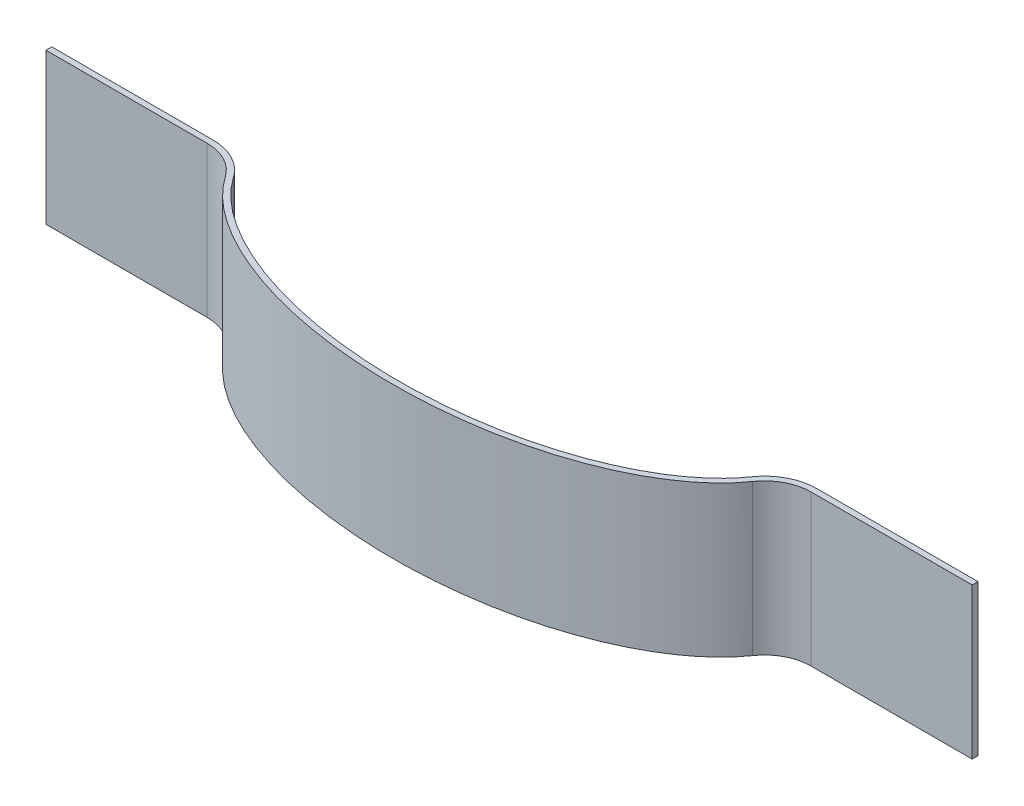
ISO-10303-21;
HEADER;
FILE_DESCRIPTION(('STEP AP214'),'2;1');
FILE_NAME('part.step','',(''),(''),'','','');
FILE_SCHEMA(('AUTOMOTIVE_DESIGN { 1 0 10303 214 1 1 1 1 }'));
ENDSEC;
DATA;
#1=APPLICATION_CONTEXT('core data for automotive mechanical design processes');
#2=APPLICATION_PROTOCOL_DEFINITION('international standard','automotive_design',2000,#1);
#3=PRODUCT_CONTEXT('',#1,'mechanical');
#4=PRODUCT('Part','Part','',(#3));
#5=PRODUCT_RELATED_PRODUCT_CATEGORY('part','',(#4));
#6=PRODUCT_DEFINITION_FORMATION('','',#4);
#7=PRODUCT_DEFINITION_CONTEXT('part definition',#1,'design');
#8=PRODUCT_DEFINITION('design','',#6,#7);
#9=PRODUCT_DEFINITION_SHAPE('','',#8);
#10=(LENGTH_UNIT() NAMED_UNIT(*) SI_UNIT(.MILLI.,.METRE.));
#11=(NAMED_UNIT(*) PLANE_ANGLE_UNIT() SI_UNIT($,.RADIAN.));
#12=(NAMED_UNIT(*) SI_UNIT($,.STERADIAN.) SOLID_ANGLE_UNIT());
#13=UNCERTAINTY_MEASURE_WITH_UNIT(LENGTH_MEASURE(1.E-05),#10,'distance_accuracy_value','');
#14=(GEOMETRIC_REPRESENTATION_CONTEXT(3) GLOBAL_UNCERTAINTY_ASSIGNED_CONTEXT((#13)) GLOBAL_UNIT_ASSIGNED_CONTEXT((#10,
#11,#12)) REPRESENTATION_CONTEXT('',''));
#15=CARTESIAN_POINT('',(0.,0.,0.));
#16=DIRECTION('',(0.,0.,1.));
#17=DIRECTION('',(1.,0.,0.));
#18=AXIS2_PLACEMENT_3D('',#15,#16,#17);
#19=CARTESIAN_POINT('',(82.8323720749977,15.9999999949704,4.99999999502958));
#20=DIRECTION('',(-1.,0.,0.));
#21=DIRECTION('',(0.,0.,1.));
#22=AXIS2_PLACEMENT_3D('',#19,#20,#21);
#23=PLANE('',#22);
#24=DIRECTION('',(0.,-1.,0.));
#25=VECTOR('',#24,1.);
#26=CARTESIAN_POINT('',(82.8323720749977,15.9999999949704,6.99999999502965));
#27=LINE('',#26,#25);
#28=CARTESIAN_POINT('',(82.8323720749977,15.9999999949704,6.99999999502965));
#29=VERTEX_POINT('',#28);
#30=CARTESIAN_POINT('',(82.8323720749977,3.,6.99999999502965));
#31=VERTEX_POINT('',#30);
#32=EDGE_CURVE('E405',#29,#31,#27,.T.);
#33=ORIENTED_EDGE('',*,*,#32,.T.);
#34=DIRECTION('',(0.,0.,-1.));
#35=VECTOR('',#34,1.);
#36=CARTESIAN_POINT('',(82.8323720749977,3.,4.99999999502958));
#37=LINE('',#36,#35);
#38=CARTESIAN_POINT('',(82.8323720749977,3.,6.49999999502962));
#39=VERTEX_POINT('',#38);
#40=EDGE_CURVE('E12',#31,#39,#37,.T.);
#41=ORIENTED_EDGE('',*,*,#40,.T.);
#42=DIRECTION('',(0.,-1.,0.));
#43=VECTOR('',#42,1.);
#44=CARTESIAN_POINT('',(82.8323720749977,15.9999999949704,6.49999999502962));
#45=LINE('',#44,#43);
#46=CARTESIAN_POINT('',(82.8323720749977,15.9999999949704,6.49999999502962));
#47=VERTEX_POINT('',#46);
#48=EDGE_CURVE('E322',#47,#39,#45,.T.);
#49=ORIENTED_EDGE('',*,*,#48,.F.);
#50=DIRECTION('',(0.,0.,-1.));
#51=VECTOR('',#50,1.);
#52=CARTESIAN_POINT('',(82.8323720749977,15.9999999949704,4.99999999502958));
#53=LINE('',#52,#51);
#54=EDGE_CURVE('E139',#29,#47,#53,.T.);
#55=ORIENTED_EDGE('',*,*,#54,.F.);
#56=EDGE_LOOP('',(#33,#41,#49,#55));
#57=FACE_BOUND('',#56,.T.);
#58=ADVANCED_FACE('F128',(#57),#23,.F.);
#59=CARTESIAN_POINT('',(3.,2.99999999999999,4.99999999502958));
#60=DIRECTION('',(1.,0.,0.));
#61=DIRECTION('',(0.,1.,0.));
#62=AXIS2_PLACEMENT_3D('',#59,#60,#61);
#63=PLANE('',#62);
#64=DIRECTION('',(0.,-1.,0.));
#65=VECTOR('',#64,1.);
#66=CARTESIAN_POINT('',(3.,15.9999999949704,6.99999999502963));
#67=LINE('',#66,#65);
#68=CARTESIAN_POINT('',(3.,15.9999999949704,6.99999999502963));
#69=VERTEX_POINT('',#68);
#70=CARTESIAN_POINT('',(3.,2.99999999999999,6.99999999502963));
#71=VERTEX_POINT('',#70);
#72=EDGE_CURVE('E400',#69,#71,#67,.T.);
#73=ORIENTED_EDGE('',*,*,#72,.F.);
#74=DIRECTION('',(0.,0.,-1.));
#75=VECTOR('',#74,1.);
#76=CARTESIAN_POINT('',(3.,15.9999999949704,4.99999999502958));
#77=LINE('',#76,#75);
#78=CARTESIAN_POINT('',(3.,15.9999999949704,6.49999999502962));
#79=VERTEX_POINT('',#78);
#80=EDGE_CURVE('E306',#69,#79,#77,.T.);
#81=ORIENTED_EDGE('',*,*,#80,.T.);
#82=DIRECTION('',(0.,-1.,0.));
#83=VECTOR('',#82,1.);
#84=CARTESIAN_POINT('',(3.,15.9999999949704,6.49999999502962));
#85=LINE('',#84,#83);
#86=CARTESIAN_POINT('',(3.,2.99999999999999,6.49999999502962));
#87=VERTEX_POINT('',#86);
#88=EDGE_CURVE('E327',#79,#87,#85,.T.);
#89=ORIENTED_EDGE('',*,*,#88,.T.);
#90=DIRECTION('',(0.,0.,-1.));
#91=VECTOR('',#90,1.);
#92=CARTESIAN_POINT('',(3.,2.99999999999999,4.99999999502958));
#93=LINE('',#92,#91);
#94=EDGE_CURVE('E304',#71,#87,#93,.T.);
#95=ORIENTED_EDGE('',*,*,#94,.F.);
#96=EDGE_LOOP('',(#73,#81,#89,#95));
#97=FACE_BOUND('',#96,.T.);
#98=ADVANCED_FACE('F263',(#97),#63,.F.);
#99=CARTESIAN_POINT('',(82.8323720749977,3.,4.99999999502958));
#100=DIRECTION('',(0.,1.,0.));
#101=DIRECTION('',(-1.,0.,0.));
#102=AXIS2_PLACEMENT_3D('',#99,#100,#101);
#103=PLANE('',#102);
#104=DIRECTION('',(-1.,0.,0.));
#105=VECTOR('',#104,1.);
#106=CARTESIAN_POINT('',(0.,2.99999999999999,6.99999999502965));
#107=LINE('',#106,#105);
#108=CARTESIAN_POINT('',(16.8897912138371,2.99999999999999,6.99999999502961));
#109=VERTEX_POINT('',#108);
#110=EDGE_CURVE('E412',#109,#71,#107,.T.);
#111=ORIENTED_EDGE('',*,*,#110,.T.);
#112=ORIENTED_EDGE('',*,*,#94,.T.);
#113=DIRECTION('',(-1.,0.,0.));
#114=VECTOR('',#113,1.);
#115=CARTESIAN_POINT('',(0.,2.99999999999999,6.49999999502965));
#116=LINE('',#115,#114);
#117=CARTESIAN_POINT('',(16.8897912138371,2.99999999999999,6.49999999502961));
#118=VERTEX_POINT('',#117);
#119=EDGE_CURVE('E289',#118,#87,#116,.T.);
#120=ORIENTED_EDGE('',*,*,#119,.F.);
#121=CARTESIAN_POINT('',(16.8897912138371,2.99999999999999,10.9999999950296));
#122=DIRECTION('',(0.,-1.,0.));
#123=DIRECTION('',(1.,0.,0.));
#124=AXIS2_PLACEMENT_3D('',#121,#122,#123);
#125=CIRCLE('',#124,4.5);
#126=CARTESIAN_POINT('',(20.5970419141015,2.99999999999999,8.44925652588402));
#127=VERTEX_POINT('',#126);
#128=EDGE_CURVE('E287',#118,#127,#125,.T.);
#129=ORIENTED_EDGE('',*,*,#128,.T.);
#130=CARTESIAN_POINT('',(65.2353301658985,3.,8.44925652588398));
#131=CARTESIAN_POINT('',(64.8805017070055,3.,8.96496422782135));
#132=CARTESIAN_POINT('',(64.4364787447375,3.,9.48700047676515));
#133=CARTESIAN_POINT('',(63.3731418806885,3.,10.518242468489));
#134=CARTESIAN_POINT('',(62.7507898739107,3.,11.0291632976975));
#135=CARTESIAN_POINT('',(61.3393789945147,3.,12.0106415730153));
#136=CARTESIAN_POINT('',(60.5491740004586,3.,12.4830373082159));
#137=CARTESIAN_POINT('',(58.8199079028753,3.,13.3651280551237));
#138=CARTESIAN_POINT('',(57.88322636954,3.,13.7749356231123));
#139=CARTESIAN_POINT('',(55.888989887528,3.,14.5215991829222));
#140=CARTESIAN_POINT('',(54.8314557800261,3.,14.8583610099948));
#141=CARTESIAN_POINT('',(52.6202204017722,3.,15.444721578542));
#142=CARTESIAN_POINT('',(51.4658389144935,3.,15.693398240126));
#143=CARTESIAN_POINT('',(47.9107668985225,3.,16.292489366061));
#144=CARTESIAN_POINT('',(45.4153646913092,3.,16.4999999950296));
#145=CARTESIAN_POINT('',(40.4170073886908,3.,16.4999999950296));
#146=CARTESIAN_POINT('',(37.9216051814775,3.,16.292489366061));
#147=CARTESIAN_POINT('',(34.3665331655065,3.,15.693398240126));
#148=CARTESIAN_POINT('',(33.2121516782278,3.,15.444721578542));
#149=CARTESIAN_POINT('',(31.0009162999739,3.,14.8583610099948));
#150=CARTESIAN_POINT('',(29.9433821924721,3.,14.5215991829222));
#151=CARTESIAN_POINT('',(27.9491457104601,3.,13.7749356231123));
#152=CARTESIAN_POINT('',(27.0124641771248,3.,13.3651280551238));
#153=CARTESIAN_POINT('',(25.2831980795414,3.,12.4830373082159));
#154=CARTESIAN_POINT('',(24.4929930854853,3.,12.0106415730153));
#155=CARTESIAN_POINT('',(23.0815822060893,3.,11.0291632976976));
#156=CARTESIAN_POINT('',(22.4592301993114,3.,10.518242468489));
#157=CARTESIAN_POINT('',(21.3958933352626,3.,9.48700047676519));
#158=CARTESIAN_POINT('',(20.9518703729945,3.,8.96496422782138));
#159=CARTESIAN_POINT('',(20.5970419141015,3.,8.44925652588401));
#160=B_SPLINE_CURVE_WITH_KNOTS('',3,(#130,#131,#132,#133,#134,#135,#136,#137,#138,#139,#140,
#141,#142,#143,#144,#145,#146,#147,#148,#149,#150,#151,#152,#153,#154,#155,#156,#157,#158,#159),
.UNSPECIFIED.,.F.,.F.,(4,2,2,2,2,2,2,2,2,2,2,2,2,2,4),(0.,0.0624999999999999,0.125,0.1875,
0.249999999999999,0.312499999999999,0.374999999999999,0.499999999999999,0.624999999999999,
0.6875,0.75,0.8125,0.875,0.9375,1.),.UNSPECIFIED.);
#161=CARTESIAN_POINT('',(65.2353301658984,3.,8.449256525884));
#162=VERTEX_POINT('',#161);
#163=EDGE_CURVE('E280',#162,#127,#160,.T.);
#164=ORIENTED_EDGE('',*,*,#163,.F.);
#165=CARTESIAN_POINT('',(68.9425808661629,3.,10.9999999950296));
#166=DIRECTION('',(0.,-1.,0.));
#167=DIRECTION('',(1.,0.,0.));
#168=AXIS2_PLACEMENT_3D('',#165,#166,#167);
#169=CIRCLE('',#168,4.49999999999999);
#170=CARTESIAN_POINT('',(68.9425808661629,3.,6.49999999502959));
#171=VERTEX_POINT('',#170);
#172=EDGE_CURVE('E284',#162,#171,#169,.T.);
#173=ORIENTED_EDGE('',*,*,#172,.T.);
#174=DIRECTION('',(-1.,0.,0.));
#175=VECTOR('',#174,1.);
#176=CARTESIAN_POINT('',(0.,2.99999999999999,6.49999999502933));
#177=LINE('',#176,#175);
#178=EDGE_CURVE('E369',#39,#171,#177,.T.);
#179=ORIENTED_EDGE('',*,*,#178,.F.);
#180=ORIENTED_EDGE('',*,*,#40,.F.);
#181=DIRECTION('',(-1.,0.,0.));
#182=VECTOR('',#181,1.);
#183=CARTESIAN_POINT('',(0.,2.99999999999999,6.99999999502933));
#184=LINE('',#183,#182);
#185=CARTESIAN_POINT('',(68.9425808661629,3.,6.99999999502959));
#186=VERTEX_POINT('',#185);
#187=EDGE_CURVE('E414',#31,#186,#184,.T.);
#188=ORIENTED_EDGE('',*,*,#187,.T.);
#189=CARTESIAN_POINT('',(68.9425808661629,3.,10.9999999950296));
#190=DIRECTION('',(0.,-1.,0.));
#191=DIRECTION('',(1.,0.,0.));
#192=AXIS2_PLACEMENT_3D('',#189,#190,#191);
#193=CIRCLE('',#192,3.99999999999999);
#194=CARTESIAN_POINT('',(65.6472469103723,3.,8.73267246690017));
#195=VERTEX_POINT('',#194);
#196=EDGE_CURVE('E417',#195,#186,#193,.T.);
#197=ORIENTED_EDGE('',*,*,#196,.F.);
#198=CARTESIAN_POINT('',(20.1851251696277,3.,8.73267246690017));
#199=CARTESIAN_POINT('',(20.5607248128136,3.,9.27856900924684));
#200=CARTESIAN_POINT('',(21.0266315071755,3.,9.82540131314369));
#201=CARTESIAN_POINT('',(22.1323018461886,3.,10.8976990215598));
#202=CARTESIAN_POINT('',(22.7760250795767,3.,11.4256908440767));
#203=CARTESIAN_POINT('',(24.2276318568974,3.,12.43512086693));
#204=CARTESIAN_POINT('',(25.0374189278772,3.,12.9189590451429));
#205=CARTESIAN_POINT('',(26.8038497796482,3.,13.8200073636043));
#206=CARTESIAN_POINT('',(27.7575497453194,3.,14.2370968898553));
#207=CARTESIAN_POINT('',(29.7843385738173,3.,14.9959483978482));
#208=CARTESIAN_POINT('',(30.857399648411,3.,15.3375848265917));
#209=CARTESIAN_POINT('',(33.0993535812104,3.,15.9320911354275));
#210=CARTESIAN_POINT('',(34.2690370549216,3.,16.1840182789922));
#211=CARTESIAN_POINT('',(37.8673359541241,3.,16.790393882437));
#212=CARTESIAN_POINT('',(40.3892433676648,3.,16.9999999950296));
#213=CARTESIAN_POINT('',(45.4431287123353,3.,16.9999999950296));
#214=CARTESIAN_POINT('',(47.965036125876,3.,16.790393882437));
#215=CARTESIAN_POINT('',(51.5633350250784,3.,16.1840182789922));
#216=CARTESIAN_POINT('',(52.7330184987896,3.,15.9320911354275));
#217=CARTESIAN_POINT('',(54.9749724315891,3.,15.3375848265917));
#218=CARTESIAN_POINT('',(56.0480335061827,3.,14.9959483978482));
#219=CARTESIAN_POINT('',(58.0748223346806,3.,14.2370968898553));
#220=CARTESIAN_POINT('',(59.0285223003519,3.,13.8200073636043));
#221=CARTESIAN_POINT('',(60.7949531521229,3.,12.9189590451429));
#222=CARTESIAN_POINT('',(61.6047402231027,3.,12.43512086693));
#223=CARTESIAN_POINT('',(63.0563470004233,3.,11.4256908440767));
#224=CARTESIAN_POINT('',(63.7000702338113,3.,10.8976990215598));
#225=CARTESIAN_POINT('',(64.8057405728246,3.,9.82540131314365));
#226=CARTESIAN_POINT('',(65.2716472671864,3.,9.2785690092468));
#227=CARTESIAN_POINT('',(65.6472469103723,3.00000000000001,8.73267246690014));
#228=B_SPLINE_CURVE_WITH_KNOTS('',3,(#198,#199,#200,#201,#202,#203,#204,#205,#206,#207,#208,
#209,#210,#211,#212,#213,#214,#215,#216,#217,#218,#219,#220,#221,#222,#223,#224,#225,#226,#227),
.UNSPECIFIED.,.F.,.F.,(4,2,2,2,2,2,2,2,2,2,2,2,2,2,4),(0.,0.0624999999999998,0.125,
0.187499999999999,0.249999999999999,0.312499999999999,0.375,0.5,0.625,0.6875,0.75,0.8125,0.875,
0.9375,1.),.UNSPECIFIED.);
#229=CARTESIAN_POINT('',(20.1851251696277,2.99999999999999,8.7326724669002));
#230=VERTEX_POINT('',#229);
#231=EDGE_CURVE('E228',#195,#230,#228,.F.);
#232=ORIENTED_EDGE('',*,*,#231,.T.);
#233=CARTESIAN_POINT('',(16.8897912138371,2.99999999999999,10.9999999950296));
#234=DIRECTION('',(0.,-1.,0.));
#235=DIRECTION('',(1.,0.,0.));
#236=AXIS2_PLACEMENT_3D('',#233,#234,#235);
#237=CIRCLE('',#236,4.);
#238=EDGE_CURVE('E245',#109,#230,#237,.T.);
#239=ORIENTED_EDGE('',*,*,#238,.F.);
#240=EDGE_LOOP('',(#111,#112,#120,#129,#164,#173,#179,#180,#188,#197,#232,#239));
#241=FACE_BOUND('',#240,.T.);
#242=ADVANCED_FACE('F130',(#241),#103,.F.);
#243=CARTESIAN_POINT('',(3.,15.9999999949704,4.99999999502958));
#244=DIRECTION('',(0.,-1.,0.));
#245=DIRECTION('',(1.,0.,0.));
#246=AXIS2_PLACEMENT_3D('',#243,#244,#245);
#247=PLANE('',#246);
#248=DIRECTION('',(-1.,0.,0.));
#249=VECTOR('',#248,1.);
#250=CARTESIAN_POINT('',(0.,15.9999999949704,6.99999999502965));
#251=LINE('',#250,#249);
#252=CARTESIAN_POINT('',(16.8897912138371,15.9999999949704,6.99999999502961));
#253=VERTEX_POINT('',#252);
#254=EDGE_CURVE('E407',#253,#69,#251,.T.);
#255=ORIENTED_EDGE('',*,*,#254,.F.);
#256=CARTESIAN_POINT('',(16.8897912138371,15.9999999949704,10.9999999950296));
#257=DIRECTION('',(0.,-1.,0.));
#258=DIRECTION('',(1.,0.,0.));
#259=AXIS2_PLACEMENT_3D('',#256,#257,#258);
#260=CIRCLE('',#259,4.);
#261=CARTESIAN_POINT('',(20.1851251696277,15.9999999949704,8.7326724669002));
#262=VERTEX_POINT('',#261);
#263=EDGE_CURVE('E231',#253,#262,#260,.T.);
#264=ORIENTED_EDGE('',*,*,#263,.T.);
#265=CARTESIAN_POINT('',(65.6472469103723,15.9999999949704,8.73267246690014));
#266=CARTESIAN_POINT('',(65.2716472671864,15.9999999949704,9.2785690092468));
#267=CARTESIAN_POINT('',(64.8057405728246,15.9999999949704,9.82540131314365));
#268=CARTESIAN_POINT('',(63.7000702338113,15.9999999949704,10.8976990215598));
#269=CARTESIAN_POINT('',(63.0563470004233,15.9999999949704,11.4256908440767));
#270=CARTESIAN_POINT('',(61.6047402231027,15.9999999949704,12.43512086693));
#271=CARTESIAN_POINT('',(60.7949531521229,15.9999999949704,12.9189590451429));
#272=CARTESIAN_POINT('',(59.0285223003519,15.9999999949704,13.8200073636043));
#273=CARTESIAN_POINT('',(58.0748223346806,15.9999999949704,14.2370968898553));
#274=CARTESIAN_POINT('',(56.0480335061827,15.9999999949704,14.9959483978482));
#275=CARTESIAN_POINT('',(54.9749724315891,15.9999999949704,15.3375848265917));
#276=CARTESIAN_POINT('',(52.7330184987896,15.9999999949704,15.9320911354275));
#277=CARTESIAN_POINT('',(51.5633350250784,15.9999999949704,16.1840182789922));
#278=CARTESIAN_POINT('',(47.965036125876,15.9999999949704,16.790393882437));
#279=CARTESIAN_POINT('',(45.4431287123353,15.9999999949704,16.9999999950296));
#280=CARTESIAN_POINT('',(40.3892433676648,15.9999999949704,16.9999999950296));
#281=CARTESIAN_POINT('',(37.8673359541241,15.9999999949704,16.790393882437));
#282=CARTESIAN_POINT('',(34.2690370549216,15.9999999949704,16.1840182789922));
#283=CARTESIAN_POINT('',(33.0993535812104,15.9999999949704,15.9320911354275));
#284=CARTESIAN_POINT('',(30.857399648411,15.9999999949704,15.3375848265917));
#285=CARTESIAN_POINT('',(29.7843385738173,15.9999999949704,14.9959483978482));
#286=CARTESIAN_POINT('',(27.7575497453194,15.9999999949704,14.2370968898553));
#287=CARTESIAN_POINT('',(26.8038497796482,15.9999999949704,13.8200073636043));
#288=CARTESIAN_POINT('',(25.0374189278772,15.9999999949704,12.9189590451429));
#289=CARTESIAN_POINT('',(24.2276318568974,15.9999999949704,12.43512086693));
#290=CARTESIAN_POINT('',(22.7760250795767,15.9999999949704,11.4256908440767));
#291=CARTESIAN_POINT('',(22.1323018461886,15.9999999949704,10.8976990215598));
#292=CARTESIAN_POINT('',(21.0266315071755,15.9999999949704,9.82540131314369));
#293=CARTESIAN_POINT('',(20.5607248128136,15.9999999949704,9.27856900924684));
#294=CARTESIAN_POINT('',(20.1851251696277,15.9999999949704,8.73267246690017));
#295=B_SPLINE_CURVE_WITH_KNOTS('',3,(#265,#266,#267,#268,#269,#270,#271,#272,#273,#274,#275,
#276,#277,#278,#279,#280,#281,#282,#283,#284,#285,#286,#287,#288,#289,#290,#291,#292,#293,#294),
.UNSPECIFIED.,.F.,.F.,(4,2,2,2,2,2,2,2,2,2,2,2,2,2,4),(0.,0.0625,0.125,0.1875,0.25,0.3125,0.375,
0.5,0.625,0.687500000000001,0.750000000000001,0.812500000000001,0.875,0.9375,1.),.UNSPECIFIED.);
#296=CARTESIAN_POINT('',(65.6472469103723,15.9999999949704,8.73267246690017));
#297=VERTEX_POINT('',#296);
#298=EDGE_CURVE('E224',#297,#262,#295,.T.);
#299=ORIENTED_EDGE('',*,*,#298,.F.);
#300=CARTESIAN_POINT('',(68.9425808661629,15.9999999949704,10.9999999950296));
#301=DIRECTION('',(0.,-1.,0.));
#302=DIRECTION('',(1.,0.,0.));
#303=AXIS2_PLACEMENT_3D('',#300,#301,#302);
#304=CIRCLE('',#303,3.99999999999999);
#305=CARTESIAN_POINT('',(68.9425808661629,15.9999999949703,6.99999999502959));
#306=VERTEX_POINT('',#305);
#307=EDGE_CURVE('E234',#297,#306,#304,.T.);
#308=ORIENTED_EDGE('',*,*,#307,.T.);
#309=DIRECTION('',(-1.,0.,0.));
#310=VECTOR('',#309,1.);
#311=CARTESIAN_POINT('',(0.,15.9999999949704,6.99999999502933));
#312=LINE('',#311,#310);
#313=EDGE_CURVE('E238',#29,#306,#312,.T.);
#314=ORIENTED_EDGE('',*,*,#313,.F.);
#315=ORIENTED_EDGE('',*,*,#54,.T.);
#316=DIRECTION('',(-1.,0.,0.));
#317=VECTOR('',#316,1.);
#318=CARTESIAN_POINT('',(0.,15.9999999949704,6.49999999502933));
#319=LINE('',#318,#317);
#320=CARTESIAN_POINT('',(68.9425808661629,15.9999999949704,6.49999999502959));
#321=VERTEX_POINT('',#320);
#322=EDGE_CURVE('E313',#47,#321,#319,.T.);
#323=ORIENTED_EDGE('',*,*,#322,.T.);
#324=CARTESIAN_POINT('',(68.9425808661629,15.9999999949704,10.9999999950296));
#325=DIRECTION('',(0.,-1.,0.));
#326=DIRECTION('',(1.,0.,0.));
#327=AXIS2_PLACEMENT_3D('',#324,#325,#326);
#328=CIRCLE('',#327,4.49999999999999);
#329=CARTESIAN_POINT('',(65.2353301658984,15.9999999949704,8.449256525884));
#330=VERTEX_POINT('',#329);
#331=EDGE_CURVE('E370',#330,#321,#328,.T.);
#332=ORIENTED_EDGE('',*,*,#331,.F.);
#333=CARTESIAN_POINT('',(20.5970419141015,15.9999999949704,8.44925652588401));
#334=CARTESIAN_POINT('',(20.9518703729945,15.9999999949704,8.96496422782138));
#335=CARTESIAN_POINT('',(21.3958933352626,15.9999999949704,9.48700047676519));
#336=CARTESIAN_POINT('',(22.4592301993114,15.9999999949704,10.518242468489));
#337=CARTESIAN_POINT('',(23.0815822060893,15.9999999949704,11.0291632976976));
#338=CARTESIAN_POINT('',(24.4929930854853,15.9999999949704,12.0106415730153));
#339=CARTESIAN_POINT('',(25.2831980795414,15.9999999949704,12.4830373082159));
#340=CARTESIAN_POINT('',(27.0124641771248,15.9999999949704,13.3651280551238));
#341=CARTESIAN_POINT('',(27.9491457104601,15.9999999949704,13.7749356231123));
#342=CARTESIAN_POINT('',(29.9433821924721,15.9999999949704,14.5215991829222));
#343=CARTESIAN_POINT('',(31.0009162999739,15.9999999949704,14.8583610099948));
#344=CARTESIAN_POINT('',(33.2121516782278,15.9999999949704,15.444721578542));
#345=CARTESIAN_POINT('',(34.3665331655065,15.9999999949704,15.693398240126));
#346=CARTESIAN_POINT('',(37.9216051814775,15.9999999949704,16.292489366061));
#347=CARTESIAN_POINT('',(40.4170073886908,15.9999999949704,16.4999999950296));
#348=CARTESIAN_POINT('',(45.4153646913092,15.9999999949704,16.4999999950296));
#349=CARTESIAN_POINT('',(47.9107668985225,15.9999999949704,16.292489366061));
#350=CARTESIAN_POINT('',(51.4658389144935,15.9999999949704,15.693398240126));
#351=CARTESIAN_POINT('',(52.6202204017722,15.9999999949704,15.444721578542));
#352=CARTESIAN_POINT('',(54.8314557800261,15.9999999949704,14.8583610099948));
#353=CARTESIAN_POINT('',(55.888989887528,15.9999999949704,14.5215991829222));
#354=CARTESIAN_POINT('',(57.88322636954,15.9999999949704,13.7749356231123));
#355=CARTESIAN_POINT('',(58.8199079028753,15.9999999949704,13.3651280551237));
#356=CARTESIAN_POINT('',(60.5491740004586,15.9999999949704,12.4830373082159));
#357=CARTESIAN_POINT('',(61.3393789945147,15.9999999949704,12.0106415730153));
#358=CARTESIAN_POINT('',(62.7507898739107,15.9999999949704,11.0291632976975));
#359=CARTESIAN_POINT('',(63.3731418806885,15.9999999949704,10.518242468489));
#360=CARTESIAN_POINT('',(64.4364787447375,15.9999999949704,9.48700047676515));
#361=CARTESIAN_POINT('',(64.8805017070055,15.9999999949704,8.96496422782135));
#362=CARTESIAN_POINT('',(65.2353301658985,15.9999999949704,8.44925652588398));
#363=B_SPLINE_CURVE_WITH_KNOTS('',3,(#333,#334,#335,#336,#337,#338,#339,#340,#341,#342,#343,
#344,#345,#346,#347,#348,#349,#350,#351,#352,#353,#354,#355,#356,#357,#358,#359,#360,#361,#362),
.UNSPECIFIED.,.F.,.F.,(4,2,2,2,2,2,2,2,2,2,2,2,2,2,4),(0.,0.0625000000000001,0.125,0.1875,0.25,
0.3125,0.375000000000001,0.500000000000001,0.625000000000001,0.687500000000001,
0.750000000000001,0.8125,0.875,0.9375,1.),.UNSPECIFIED.);
#364=CARTESIAN_POINT('',(20.5970419141015,15.9999999949704,8.44925652588401));
#365=VERTEX_POINT('',#364);
#366=EDGE_CURVE('E337',#330,#365,#363,.F.);
#367=ORIENTED_EDGE('',*,*,#366,.T.);
#368=CARTESIAN_POINT('',(16.8897912138371,15.9999999949704,10.9999999950296));
#369=DIRECTION('',(0.,-1.,0.));
#370=DIRECTION('',(1.,0.,0.));
#371=AXIS2_PLACEMENT_3D('',#368,#369,#370);
#372=CIRCLE('',#371,4.5);
#373=CARTESIAN_POINT('',(16.8897912138371,15.9999999949704,6.49999999502961));
#374=VERTEX_POINT('',#373);
#375=EDGE_CURVE('E366',#374,#365,#372,.T.);
#376=ORIENTED_EDGE('',*,*,#375,.F.);
#377=DIRECTION('',(-1.,0.,0.));
#378=VECTOR('',#377,1.);
#379=CARTESIAN_POINT('',(0.,15.9999999949704,6.49999999502965));
#380=LINE('',#379,#378);
#381=EDGE_CURVE('E324',#374,#79,#380,.T.);
#382=ORIENTED_EDGE('',*,*,#381,.T.);
#383=ORIENTED_EDGE('',*,*,#80,.F.);
#384=EDGE_LOOP('',(#255,#264,#299,#308,#314,#315,#323,#332,#367,#376,#382,#383));
#385=FACE_BOUND('',#384,.T.);
#386=ADVANCED_FACE('F243',(#385),#247,.F.);
#387=CARTESIAN_POINT('',(68.9425808661629,15.9999999949704,10.9999999950296));
#388=DIRECTION('',(0.,-1.,0.));
#389=DIRECTION('',(1.,0.,0.));
#390=AXIS2_PLACEMENT_3D('',#387,#388,#389);
#391=CYLINDRICAL_SURFACE('',#390,4.49999999999999);
#392=ORIENTED_EDGE('',*,*,#172,.F.);
#393=DIRECTION('',(0.,-1.,0.));
#394=VECTOR('',#393,1.);
#395=CARTESIAN_POINT('',(65.2353301658984,15.9999999949704,8.449256525884));
#396=LINE('',#395,#394);
#397=EDGE_CURVE('E323',#330,#162,#396,.T.);
#398=ORIENTED_EDGE('',*,*,#397,.F.);
#399=ORIENTED_EDGE('',*,*,#331,.T.);
#400=DIRECTION('',(0.,-1.,0.));
#401=VECTOR('',#400,1.);
#402=CARTESIAN_POINT('',(68.9425808661629,15.9999999949704,6.49999999502959));
#403=LINE('',#402,#401);
#404=EDGE_CURVE('E307',#321,#171,#403,.T.);
#405=ORIENTED_EDGE('',*,*,#404,.T.);
#406=EDGE_LOOP('',(#392,#398,#399,#405));
#407=FACE_BOUND('',#406,.T.);
#408=ADVANCED_FACE('F262',(#407),#391,.T.);
#409=CARTESIAN_POINT('',(0.,15.9999999949704,6.49999999502933));
#410=DIRECTION('',(0.,0.,1.));
#411=DIRECTION('',(1.,0.,0.));
#412=AXIS2_PLACEMENT_3D('',#409,#410,#411);
#413=PLANE('',#412);
#414=ORIENTED_EDGE('',*,*,#178,.T.);
#415=ORIENTED_EDGE('',*,*,#404,.F.);
#416=ORIENTED_EDGE('',*,*,#322,.F.);
#417=ORIENTED_EDGE('',*,*,#48,.T.);
#418=EDGE_LOOP('',(#414,#415,#416,#417));
#419=FACE_BOUND('',#418,.T.);
#420=ADVANCED_FACE('F321',(#419),#413,.F.);
#421=CARTESIAN_POINT('',(0.,15.9999999949704,6.49999999502965));
#422=DIRECTION('',(0.,0.,1.));
#423=DIRECTION('',(1.,0.,0.));
#424=AXIS2_PLACEMENT_3D('',#421,#422,#423);
#425=PLANE('',#424);
#426=ORIENTED_EDGE('',*,*,#119,.T.);
#427=ORIENTED_EDGE('',*,*,#88,.F.);
#428=ORIENTED_EDGE('',*,*,#381,.F.);
#429=DIRECTION('',(0.,-1.,0.));
#430=VECTOR('',#429,1.);
#431=CARTESIAN_POINT('',(16.8897912138371,15.9999999949704,6.49999999502961));
#432=LINE('',#431,#430);
#433=EDGE_CURVE('E331',#374,#118,#432,.T.);
#434=ORIENTED_EDGE('',*,*,#433,.T.);
#435=EDGE_LOOP('',(#426,#427,#428,#434));
#436=FACE_BOUND('',#435,.T.);
#437=ADVANCED_FACE('F388',(#436),#425,.F.);
#438=CARTESIAN_POINT('',(16.8897912138371,15.9999999949704,10.9999999950296));
#439=DIRECTION('',(0.,-1.,0.));
#440=DIRECTION('',(1.,0.,0.));
#441=AXIS2_PLACEMENT_3D('',#438,#439,#440);
#442=CYLINDRICAL_SURFACE('',#441,4.5);
#443=ORIENTED_EDGE('',*,*,#128,.F.);
#444=ORIENTED_EDGE('',*,*,#433,.F.);
#445=ORIENTED_EDGE('',*,*,#375,.T.);
#446=DIRECTION('',(0.,-1.,0.));
#447=VECTOR('',#446,1.);
#448=CARTESIAN_POINT('',(20.5970419141015,15.9999999949704,8.44925652588402));
#449=LINE('',#448,#447);
#450=EDGE_CURVE('E155',#365,#127,#449,.T.);
#451=ORIENTED_EDGE('',*,*,#450,.T.);
#452=EDGE_LOOP('',(#443,#444,#445,#451));
#453=FACE_BOUND('',#452,.T.);
#454=ADVANCED_FACE('F352',(#453),#442,.T.);
#455=CARTESIAN_POINT('',(65.2353301658985,15.9999999949704,8.44925652588398));
#456=CARTESIAN_POINT('',(64.8805017070055,15.9999999949704,8.96496422782135));
#457=CARTESIAN_POINT('',(64.4364787447375,15.9999999949704,9.48700047676515));
#458=CARTESIAN_POINT('',(63.3731418806885,15.9999999949704,10.518242468489));
#459=CARTESIAN_POINT('',(62.7507898739107,15.9999999949704,11.0291632976975));
#460=CARTESIAN_POINT('',(61.3393789945147,15.9999999949704,12.0106415730153));
#461=CARTESIAN_POINT('',(60.5491740004586,15.9999999949704,12.4830373082159));
#462=CARTESIAN_POINT('',(58.8199079028753,15.9999999949704,13.3651280551237));
#463=CARTESIAN_POINT('',(57.88322636954,15.9999999949704,13.7749356231123));
#464=CARTESIAN_POINT('',(55.888989887528,15.9999999949704,14.5215991829222));
#465=CARTESIAN_POINT('',(54.8314557800261,15.9999999949704,14.8583610099948));
#466=CARTESIAN_POINT('',(52.6202204017722,15.9999999949704,15.444721578542));
#467=CARTESIAN_POINT('',(51.4658389144935,15.9999999949704,15.693398240126));
#468=CARTESIAN_POINT('',(47.9107668985225,15.9999999949704,16.292489366061));
#469=CARTESIAN_POINT('',(45.4153646913092,15.9999999949704,16.4999999950296));
#470=CARTESIAN_POINT('',(40.4170073886908,15.9999999949704,16.4999999950296));
#471=CARTESIAN_POINT('',(37.9216051814775,15.9999999949704,16.292489366061));
#472=CARTESIAN_POINT('',(34.3665331655065,15.9999999949704,15.693398240126));
#473=CARTESIAN_POINT('',(33.2121516782278,15.9999999949704,15.444721578542));
#474=CARTESIAN_POINT('',(31.0009162999739,15.9999999949704,14.8583610099948));
#475=CARTESIAN_POINT('',(29.9433821924721,15.9999999949704,14.5215991829222));
#476=CARTESIAN_POINT('',(27.9491457104601,15.9999999949704,13.7749356231123));
#477=CARTESIAN_POINT('',(27.0124641771248,15.9999999949704,13.3651280551238));
#478=CARTESIAN_POINT('',(25.2831980795414,15.9999999949704,12.4830373082159));
#479=CARTESIAN_POINT('',(24.4929930854853,15.9999999949704,12.0106415730153));
#480=CARTESIAN_POINT('',(23.0815822060893,15.9999999949704,11.0291632976976));
#481=CARTESIAN_POINT('',(22.4592301993114,15.9999999949704,10.518242468489));
#482=CARTESIAN_POINT('',(21.3958933352626,15.9999999949704,9.48700047676519));
#483=CARTESIAN_POINT('',(20.9518703729945,15.9999999949704,8.96496422782138));
#484=CARTESIAN_POINT('',(20.5970419141015,15.9999999949704,8.44925652588401));
#485=B_SPLINE_CURVE_WITH_KNOTS('',3,(#455,#456,#457,#458,#459,#460,#461,#462,#463,#464,#465,
#466,#467,#468,#469,#470,#471,#472,#473,#474,#475,#476,#477,#478,#479,#480,#481,#482,#483,#484),
.UNSPECIFIED.,.F.,.F.,(4,2,2,2,2,2,2,2,2,2,2,2,2,2,4),(0.,0.0624999999999999,0.125,0.1875,
0.249999999999999,0.312499999999999,0.374999999999999,0.499999999999999,0.624999999999999,
0.6875,0.75,0.8125,0.875,0.9375,1.),.UNSPECIFIED.);
#486=DIRECTION('',(0.,-1.,0.));
#487=VECTOR('',#486,1.);
#488=SURFACE_OF_LINEAR_EXTRUSION('',#485,#487);
#489=ORIENTED_EDGE('',*,*,#163,.T.);
#490=ORIENTED_EDGE('',*,*,#450,.F.);
#491=ORIENTED_EDGE('',*,*,#366,.F.);
#492=ORIENTED_EDGE('',*,*,#397,.T.);
#493=EDGE_LOOP('',(#489,#490,#491,#492));
#494=FACE_BOUND('',#493,.T.);
#495=ADVANCED_FACE('F342',(#494),#488,.F.);
#496=CARTESIAN_POINT('',(65.6472469103723,15.9999999949704,8.73267246690014));
#497=CARTESIAN_POINT('',(65.2716472671864,15.9999999949704,9.2785690092468));
#498=CARTESIAN_POINT('',(64.8057405728246,15.9999999949704,9.82540131314365));
#499=CARTESIAN_POINT('',(63.7000702338113,15.9999999949704,10.8976990215598));
#500=CARTESIAN_POINT('',(63.0563470004233,15.9999999949704,11.4256908440767));
#501=CARTESIAN_POINT('',(61.6047402231027,15.9999999949704,12.43512086693));
#502=CARTESIAN_POINT('',(60.7949531521229,15.9999999949704,12.9189590451429));
#503=CARTESIAN_POINT('',(59.0285223003519,15.9999999949704,13.8200073636043));
#504=CARTESIAN_POINT('',(58.0748223346806,15.9999999949704,14.2370968898553));
#505=CARTESIAN_POINT('',(56.0480335061827,15.9999999949704,14.9959483978482));
#506=CARTESIAN_POINT('',(54.9749724315891,15.9999999949704,15.3375848265917));
#507=CARTESIAN_POINT('',(52.7330184987896,15.9999999949704,15.9320911354275));
#508=CARTESIAN_POINT('',(51.5633350250784,15.9999999949704,16.1840182789922));
#509=CARTESIAN_POINT('',(47.965036125876,15.9999999949704,16.790393882437));
#510=CARTESIAN_POINT('',(45.4431287123353,15.9999999949704,16.9999999950296));
#511=CARTESIAN_POINT('',(40.3892433676648,15.9999999949704,16.9999999950296));
#512=CARTESIAN_POINT('',(37.8673359541241,15.9999999949704,16.790393882437));
#513=CARTESIAN_POINT('',(34.2690370549216,15.9999999949704,16.1840182789922));
#514=CARTESIAN_POINT('',(33.0993535812104,15.9999999949704,15.9320911354275));
#515=CARTESIAN_POINT('',(30.857399648411,15.9999999949704,15.3375848265917));
#516=CARTESIAN_POINT('',(29.7843385738173,15.9999999949704,14.9959483978482));
#517=CARTESIAN_POINT('',(27.7575497453194,15.9999999949704,14.2370968898553));
#518=CARTESIAN_POINT('',(26.8038497796482,15.9999999949704,13.8200073636043));
#519=CARTESIAN_POINT('',(25.0374189278772,15.9999999949704,12.9189590451429));
#520=CARTESIAN_POINT('',(24.2276318568974,15.9999999949704,12.43512086693));
#521=CARTESIAN_POINT('',(22.7760250795767,15.9999999949704,11.4256908440767));
#522=CARTESIAN_POINT('',(22.1323018461886,15.9999999949704,10.8976990215598));
#523=CARTESIAN_POINT('',(21.0266315071755,15.9999999949704,9.82540131314369));
#524=CARTESIAN_POINT('',(20.5607248128136,15.9999999949704,9.27856900924684));
#525=CARTESIAN_POINT('',(20.1851251696277,15.9999999949704,8.73267246690017));
#526=B_SPLINE_CURVE_WITH_KNOTS('',3,(#496,#497,#498,#499,#500,#501,#502,#503,#504,#505,#506,
#507,#508,#509,#510,#511,#512,#513,#514,#515,#516,#517,#518,#519,#520,#521,#522,#523,#524,#525),
.UNSPECIFIED.,.F.,.F.,(4,2,2,2,2,2,2,2,2,2,2,2,2,2,4),(0.,0.0625,0.125,0.1875,0.25,0.3125,0.375,
0.5,0.625,0.687500000000001,0.750000000000001,0.812500000000001,0.875,0.9375,1.),.UNSPECIFIED.);
#527=DIRECTION('',(0.,-1.,0.));
#528=VECTOR('',#527,1.);
#529=SURFACE_OF_LINEAR_EXTRUSION('',#526,#528);
#530=ORIENTED_EDGE('',*,*,#231,.F.);
#531=DIRECTION('',(0.,-1.,0.));
#532=VECTOR('',#531,1.);
#533=CARTESIAN_POINT('',(65.6472469103723,15.9999999949704,8.73267246690017));
#534=LINE('',#533,#532);
#535=EDGE_CURVE('E221',#297,#195,#534,.T.);
#536=ORIENTED_EDGE('',*,*,#535,.F.);
#537=ORIENTED_EDGE('',*,*,#298,.T.);
#538=DIRECTION('',(0.,-1.,0.));
#539=VECTOR('',#538,1.);
#540=CARTESIAN_POINT('',(20.1851251696277,15.9999999949704,8.7326724669002));
#541=LINE('',#540,#539);
#542=EDGE_CURVE('E291',#262,#230,#541,.T.);
#543=ORIENTED_EDGE('',*,*,#542,.T.);
#544=EDGE_LOOP('',(#530,#536,#537,#543));
#545=FACE_BOUND('',#544,.T.);
#546=ADVANCED_FACE('F222',(#545),#529,.T.);
#547=CARTESIAN_POINT('',(16.8897912138371,15.9999999949704,10.9999999950296));
#548=DIRECTION('',(0.,-1.,0.));
#549=DIRECTION('',(1.,0.,0.));
#550=AXIS2_PLACEMENT_3D('',#547,#548,#549);
#551=CYLINDRICAL_SURFACE('',#550,4.);
#552=ORIENTED_EDGE('',*,*,#238,.T.);
#553=ORIENTED_EDGE('',*,*,#542,.F.);
#554=ORIENTED_EDGE('',*,*,#263,.F.);
#555=DIRECTION('',(0.,-1.,0.));
#556=VECTOR('',#555,1.);
#557=CARTESIAN_POINT('',(16.8897912138371,15.9999999949704,6.99999999502961));
#558=LINE('',#557,#556);
#559=EDGE_CURVE('E293',#253,#109,#558,.T.);
#560=ORIENTED_EDGE('',*,*,#559,.T.);
#561=EDGE_LOOP('',(#552,#553,#554,#560));
#562=FACE_BOUND('',#561,.T.);
#563=ADVANCED_FACE('F437',(#562),#551,.F.);
#564=CARTESIAN_POINT('',(0.,15.9999999949704,6.99999999502965));
#565=DIRECTION('',(0.,0.,1.));
#566=DIRECTION('',(1.,0.,0.));
#567=AXIS2_PLACEMENT_3D('',#564,#565,#566);
#568=PLANE('',#567);
#569=ORIENTED_EDGE('',*,*,#110,.F.);
#570=ORIENTED_EDGE('',*,*,#559,.F.);
#571=ORIENTED_EDGE('',*,*,#254,.T.);
#572=ORIENTED_EDGE('',*,*,#72,.T.);
#573=EDGE_LOOP('',(#569,#570,#571,#572));
#574=FACE_BOUND('',#573,.T.);
#575=ADVANCED_FACE('F466',(#574),#568,.T.);
#576=CARTESIAN_POINT('',(0.,15.9999999949704,6.99999999502933));
#577=DIRECTION('',(0.,0.,1.));
#578=DIRECTION('',(1.,0.,0.));
#579=AXIS2_PLACEMENT_3D('',#576,#577,#578);
#580=PLANE('',#579);
#581=ORIENTED_EDGE('',*,*,#187,.F.);
#582=ORIENTED_EDGE('',*,*,#32,.F.);
#583=ORIENTED_EDGE('',*,*,#313,.T.);
#584=DIRECTION('',(0.,-1.,0.));
#585=VECTOR('',#584,1.);
#586=CARTESIAN_POINT('',(68.9425808661629,15.9999999949704,6.99999999502959));
#587=LINE('',#586,#585);
#588=EDGE_CURVE('E147',#306,#186,#587,.T.);
#589=ORIENTED_EDGE('',*,*,#588,.T.);
#590=EDGE_LOOP('',(#581,#582,#583,#589));
#591=FACE_BOUND('',#590,.T.);
#592=ADVANCED_FACE('F464',(#591),#580,.T.);
#593=CARTESIAN_POINT('',(68.9425808661629,15.9999999949704,10.9999999950296));
#594=DIRECTION('',(0.,-1.,0.));
#595=DIRECTION('',(1.,0.,0.));
#596=AXIS2_PLACEMENT_3D('',#593,#594,#595);
#597=CYLINDRICAL_SURFACE('',#596,3.99999999999999);
#598=ORIENTED_EDGE('',*,*,#196,.T.);
#599=ORIENTED_EDGE('',*,*,#588,.F.);
#600=ORIENTED_EDGE('',*,*,#307,.F.);
#601=ORIENTED_EDGE('',*,*,#535,.T.);
#602=EDGE_LOOP('',(#598,#599,#600,#601));
#603=FACE_BOUND('',#602,.T.);
#604=ADVANCED_FACE('F235',(#603),#597,.F.);
#605=CLOSED_SHELL('',(#58,#98,#242,#386,#408,#420,#437,#454,#495,#546,#563,#575,#592,#604));
#606=MANIFOLD_SOLID_BREP('B2',#605);
#607=ADVANCED_BREP_SHAPE_REPRESENTATION('',(#18,#606),#14);
#608=SHAPE_DEFINITION_REPRESENTATION(#9,#607);
ENDSEC;
END-ISO-10303-21;
